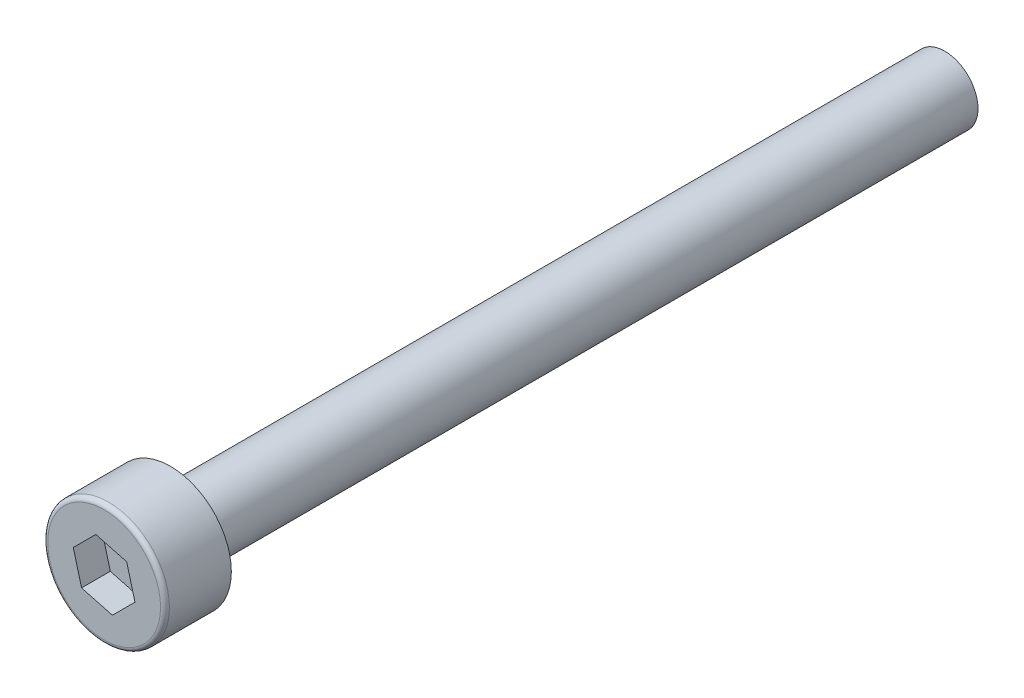
ISO-10303-21;
HEADER;
FILE_DESCRIPTION(('STEP AP214'),'2;1');
FILE_NAME('part.step','',(''),(''),'','','');
FILE_SCHEMA(('AUTOMOTIVE_DESIGN { 1 0 10303 214 1 1 1 1 }'));
ENDSEC;
DATA;
#1=APPLICATION_CONTEXT('core data for automotive mechanical design processes');
#2=APPLICATION_PROTOCOL_DEFINITION('international standard','automotive_design',2000,#1);
#3=PRODUCT_CONTEXT('',#1,'mechanical');
#4=PRODUCT('Part','Part','',(#3));
#5=PRODUCT_RELATED_PRODUCT_CATEGORY('part','',(#4));
#6=PRODUCT_DEFINITION_FORMATION('','',#4);
#7=PRODUCT_DEFINITION_CONTEXT('part definition',#1,'design');
#8=PRODUCT_DEFINITION('design','',#6,#7);
#9=PRODUCT_DEFINITION_SHAPE('','',#8);
#10=(LENGTH_UNIT() NAMED_UNIT(*) SI_UNIT(.MILLI.,.METRE.));
#11=(NAMED_UNIT(*) PLANE_ANGLE_UNIT() SI_UNIT($,.RADIAN.));
#12=(NAMED_UNIT(*) SI_UNIT($,.STERADIAN.) SOLID_ANGLE_UNIT());
#13=UNCERTAINTY_MEASURE_WITH_UNIT(LENGTH_MEASURE(1.E-05),#10,'distance_accuracy_value','');
#14=(GEOMETRIC_REPRESENTATION_CONTEXT(3) GLOBAL_UNCERTAINTY_ASSIGNED_CONTEXT((#13)) GLOBAL_UNIT_ASSIGNED_CONTEXT((#10,
#11,#12)) REPRESENTATION_CONTEXT('',''));
#15=CARTESIAN_POINT('',(0.,0.,0.));
#16=DIRECTION('',(0.,0.,1.));
#17=DIRECTION('',(1.,0.,0.));
#18=AXIS2_PLACEMENT_3D('',#15,#16,#17);
#19=CARTESIAN_POINT('',(0.,0.,0.));
#20=DIRECTION('',(0.,0.,1.));
#21=DIRECTION('',(1.,0.,0.));
#22=AXIS2_PLACEMENT_3D('',#19,#20,#21);
#23=PLANE('',#22);
#24=CARTESIAN_POINT('',(0.,0.,0.));
#25=DIRECTION('',(0.,0.,1.));
#26=DIRECTION('',(1.,0.,0.));
#27=AXIS2_PLACEMENT_3D('',#24,#25,#26);
#28=CIRCLE('',#27,2.75);
#29=CARTESIAN_POINT('',(2.75,0.,0.));
#30=VERTEX_POINT('',#29);
#31=EDGE_CURVE('E137',#30,#30,#28,.T.);
#32=ORIENTED_EDGE('',*,*,#31,.F.);
#33=EDGE_LOOP('',(#32));
#34=FACE_BOUND('',#33,.T.);
#35=CARTESIAN_POINT('',(0.,0.,0.));
#36=DIRECTION('',(0.,0.,1.));
#37=DIRECTION('',(1.,0.,0.));
#38=AXIS2_PLACEMENT_3D('',#35,#36,#37);
#39=CIRCLE('',#38,1.5);
#40=CARTESIAN_POINT('',(1.5,0.,0.));
#41=VERTEX_POINT('',#40);
#42=EDGE_CURVE('E145',#41,#41,#39,.F.);
#43=ORIENTED_EDGE('',*,*,#42,.F.);
#44=EDGE_LOOP('',(#43));
#45=FACE_BOUND('',#44,.T.);
#46=ADVANCED_FACE('F34',(#34,#45),#23,.F.);
#47=CARTESIAN_POINT('',(0.,0.,3.));
#48=DIRECTION('',(0.,0.,-1.));
#49=DIRECTION('',(-1.,0.,0.));
#50=AXIS2_PLACEMENT_3D('',#47,#48,#49);
#51=CYLINDRICAL_SURFACE('',#50,2.75);
#52=CARTESIAN_POINT('',(0.,0.,2.8));
#53=DIRECTION('',(0.,0.,1.));
#54=DIRECTION('',(1.,0.,0.));
#55=AXIS2_PLACEMENT_3D('',#52,#53,#54);
#56=CIRCLE('',#55,2.75);
#57=CARTESIAN_POINT('',(2.75,0.,2.8));
#58=VERTEX_POINT('',#57);
#59=EDGE_CURVE('E11',#58,#58,#56,.F.);
#60=ORIENTED_EDGE('',*,*,#59,.T.);
#61=EDGE_LOOP('',(#60));
#62=FACE_BOUND('',#61,.T.);
#63=ORIENTED_EDGE('',*,*,#31,.T.);
#64=EDGE_LOOP('',(#63));
#65=FACE_BOUND('',#64,.T.);
#66=ADVANCED_FACE('F164',(#62,#65),#51,.T.);
#67=CARTESIAN_POINT('',(0.,0.,3.));
#68=DIRECTION('',(0.,0.,1.));
#69=DIRECTION('',(1.,0.,0.));
#70=AXIS2_PLACEMENT_3D('',#67,#68,#69);
#71=PLANE('',#70);
#72=CARTESIAN_POINT('',(0.,0.,3.));
#73=DIRECTION('',(0.,0.,1.));
#74=DIRECTION('',(1.,0.,0.));
#75=AXIS2_PLACEMENT_3D('',#72,#73,#74);
#76=CIRCLE('',#75,2.55);
#77=CARTESIAN_POINT('',(2.55,0.,3.));
#78=VERTEX_POINT('',#77);
#79=EDGE_CURVE('E42',#78,#78,#76,.T.);
#80=ORIENTED_EDGE('',*,*,#79,.T.);
#81=EDGE_LOOP('',(#80));
#82=FACE_BOUND('',#81,.T.);
#83=DIRECTION('',(0.258819045102521,-0.965925826289068,0.));
#84=VECTOR('',#83,1.);
#85=CARTESIAN_POINT('',(-1.39419383956301,0.373573113403356,3.));
#86=LINE('',#85,#84);
#87=CARTESIAN_POINT('',(-1.39419383956301,0.373573113403356,3.));
#88=VERTEX_POINT('',#87);
#89=CARTESIAN_POINT('',(-1.02062072615966,-1.02062072615966,3.));
#90=VERTEX_POINT('',#89);
#91=EDGE_CURVE('E49',#88,#90,#86,.T.);
#92=ORIENTED_EDGE('',*,*,#91,.F.);
#93=DIRECTION('',(-0.707106781186548,-0.707106781186548,0.));
#94=VECTOR('',#93,1.);
#95=CARTESIAN_POINT('',(-0.373573113403355,1.39419383956301,3.));
#96=LINE('',#95,#94);
#97=CARTESIAN_POINT('',(-0.373573113403355,1.39419383956301,3.));
#98=VERTEX_POINT('',#97);
#99=EDGE_CURVE('E133',#98,#88,#96,.T.);
#100=ORIENTED_EDGE('',*,*,#99,.F.);
#101=DIRECTION('',(-0.965925826289068,0.258819045102521,0.));
#102=VECTOR('',#101,1.);
#103=CARTESIAN_POINT('',(1.02062072615966,1.02062072615966,3.));
#104=LINE('',#103,#102);
#105=CARTESIAN_POINT('',(1.02062072615966,1.02062072615966,3.));
#106=VERTEX_POINT('',#105);
#107=EDGE_CURVE('E131',#106,#98,#104,.T.);
#108=ORIENTED_EDGE('',*,*,#107,.F.);
#109=DIRECTION('',(-0.258819045102521,0.965925826289068,0.));
#110=VECTOR('',#109,1.);
#111=CARTESIAN_POINT('',(1.39419383956301,-0.373573113403355,3.));
#112=LINE('',#111,#110);
#113=CARTESIAN_POINT('',(1.39419383956301,-0.373573113403355,3.));
#114=VERTEX_POINT('',#113);
#115=EDGE_CURVE('E97',#114,#106,#112,.T.);
#116=ORIENTED_EDGE('',*,*,#115,.F.);
#117=DIRECTION('',(0.707106781186548,0.707106781186548,0.));
#118=VECTOR('',#117,1.);
#119=CARTESIAN_POINT('',(0.373573113403355,-1.39419383956301,3.));
#120=LINE('',#119,#118);
#121=CARTESIAN_POINT('',(0.373573113403355,-1.39419383956301,3.));
#122=VERTEX_POINT('',#121);
#123=EDGE_CURVE('E127',#122,#114,#120,.T.);
#124=ORIENTED_EDGE('',*,*,#123,.F.);
#125=DIRECTION('',(0.965925826289068,-0.258819045102521,0.));
#126=VECTOR('',#125,1.);
#127=CARTESIAN_POINT('',(-1.02062072615966,-1.02062072615966,3.));
#128=LINE('',#127,#126);
#129=EDGE_CURVE('E123',#90,#122,#128,.T.);
#130=ORIENTED_EDGE('',*,*,#129,.F.);
#131=EDGE_LOOP('',(#92,#100,#108,#116,#124,#130));
#132=FACE_BOUND('',#131,.T.);
#133=ADVANCED_FACE('F150',(#82,#132),#71,.T.);
#134=CARTESIAN_POINT('',(-1.39419383956301,0.373573113403356,1.7));
#135=DIRECTION('',(-0.965925826289068,-0.258819045102521,0.));
#136=DIRECTION('',(0.258819045102521,-0.965925826289068,0.));
#137=AXIS2_PLACEMENT_3D('',#134,#135,#136);
#138=PLANE('',#137);
#139=ORIENTED_EDGE('',*,*,#91,.T.);
#140=DIRECTION('',(0.,0.,1.));
#141=VECTOR('',#140,1.);
#142=CARTESIAN_POINT('',(-1.02062072615966,-1.02062072615966,1.7));
#143=LINE('',#142,#141);
#144=CARTESIAN_POINT('',(-1.02062072615966,-1.02062072615966,1.7));
#145=VERTEX_POINT('',#144);
#146=EDGE_CURVE('E79',#145,#90,#143,.T.);
#147=ORIENTED_EDGE('',*,*,#146,.F.);
#148=DIRECTION('',(0.258819045102521,-0.965925826289068,0.));
#149=VECTOR('',#148,1.);
#150=CARTESIAN_POINT('',(-1.39419383956301,0.373573113403356,1.7));
#151=LINE('',#150,#149);
#152=CARTESIAN_POINT('',(-1.39419383956301,0.373573113403356,1.7));
#153=VERTEX_POINT('',#152);
#154=EDGE_CURVE('E135',#153,#145,#151,.T.);
#155=ORIENTED_EDGE('',*,*,#154,.F.);
#156=DIRECTION('',(0.,0.,1.));
#157=VECTOR('',#156,1.);
#158=CARTESIAN_POINT('',(-1.39419383956301,0.373573113403356,1.7));
#159=LINE('',#158,#157);
#160=EDGE_CURVE('E57',#153,#88,#159,.T.);
#161=ORIENTED_EDGE('',*,*,#160,.T.);
#162=EDGE_LOOP('',(#139,#147,#155,#161));
#163=FACE_BOUND('',#162,.T.);
#164=ADVANCED_FACE('F176',(#163),#138,.F.);
#165=CARTESIAN_POINT('',(-0.373573113403355,1.39419383956301,1.7));
#166=DIRECTION('',(-0.707106781186548,0.707106781186548,0.));
#167=DIRECTION('',(-0.707106781186548,-0.707106781186548,0.));
#168=AXIS2_PLACEMENT_3D('',#165,#166,#167);
#169=PLANE('',#168);
#170=ORIENTED_EDGE('',*,*,#99,.T.);
#171=ORIENTED_EDGE('',*,*,#160,.F.);
#172=DIRECTION('',(-0.707106781186548,-0.707106781186548,0.));
#173=VECTOR('',#172,1.);
#174=CARTESIAN_POINT('',(-0.373573113403355,1.39419383956301,1.7));
#175=LINE('',#174,#173);
#176=CARTESIAN_POINT('',(-0.373573113403355,1.39419383956301,1.7));
#177=VERTEX_POINT('',#176);
#178=EDGE_CURVE('E109',#177,#153,#175,.T.);
#179=ORIENTED_EDGE('',*,*,#178,.F.);
#180=DIRECTION('',(0.,0.,1.));
#181=VECTOR('',#180,1.);
#182=CARTESIAN_POINT('',(-0.373573113403355,1.39419383956301,1.7));
#183=LINE('',#182,#181);
#184=EDGE_CURVE('E101',#177,#98,#183,.T.);
#185=ORIENTED_EDGE('',*,*,#184,.T.);
#186=EDGE_LOOP('',(#170,#171,#179,#185));
#187=FACE_BOUND('',#186,.T.);
#188=ADVANCED_FACE('F179',(#187),#169,.F.);
#189=CARTESIAN_POINT('',(1.02062072615966,1.02062072615966,1.7));
#190=DIRECTION('',(0.258819045102521,0.965925826289068,0.));
#191=DIRECTION('',(-0.965925826289068,0.258819045102521,0.));
#192=AXIS2_PLACEMENT_3D('',#189,#190,#191);
#193=PLANE('',#192);
#194=ORIENTED_EDGE('',*,*,#107,.T.);
#195=ORIENTED_EDGE('',*,*,#184,.F.);
#196=DIRECTION('',(-0.965925826289068,0.258819045102521,0.));
#197=VECTOR('',#196,1.);
#198=CARTESIAN_POINT('',(1.02062072615966,1.02062072615966,1.7));
#199=LINE('',#198,#197);
#200=CARTESIAN_POINT('',(1.02062072615966,1.02062072615966,1.7));
#201=VERTEX_POINT('',#200);
#202=EDGE_CURVE('E105',#201,#177,#199,.T.);
#203=ORIENTED_EDGE('',*,*,#202,.F.);
#204=DIRECTION('',(0.,0.,1.));
#205=VECTOR('',#204,1.);
#206=CARTESIAN_POINT('',(1.02062072615966,1.02062072615966,1.7));
#207=LINE('',#206,#205);
#208=EDGE_CURVE('E90',#201,#106,#207,.T.);
#209=ORIENTED_EDGE('',*,*,#208,.T.);
#210=EDGE_LOOP('',(#194,#195,#203,#209));
#211=FACE_BOUND('',#210,.T.);
#212=ADVANCED_FACE('F106',(#211),#193,.F.);
#213=CARTESIAN_POINT('',(1.39419383956301,-0.373573113403355,1.7));
#214=DIRECTION('',(0.965925826289068,0.258819045102521,0.));
#215=DIRECTION('',(-0.258819045102521,0.965925826289068,0.));
#216=AXIS2_PLACEMENT_3D('',#213,#214,#215);
#217=PLANE('',#216);
#218=ORIENTED_EDGE('',*,*,#115,.T.);
#219=ORIENTED_EDGE('',*,*,#208,.F.);
#220=DIRECTION('',(-0.258819045102521,0.965925826289068,0.));
#221=VECTOR('',#220,1.);
#222=CARTESIAN_POINT('',(1.39419383956301,-0.373573113403355,1.7));
#223=LINE('',#222,#221);
#224=CARTESIAN_POINT('',(1.39419383956301,-0.373573113403355,1.7));
#225=VERTEX_POINT('',#224);
#226=EDGE_CURVE('E94',#225,#201,#223,.T.);
#227=ORIENTED_EDGE('',*,*,#226,.F.);
#228=DIRECTION('',(0.,0.,1.));
#229=VECTOR('',#228,1.);
#230=CARTESIAN_POINT('',(1.39419383956301,-0.373573113403355,1.7));
#231=LINE('',#230,#229);
#232=EDGE_CURVE('E102',#225,#114,#231,.T.);
#233=ORIENTED_EDGE('',*,*,#232,.T.);
#234=EDGE_LOOP('',(#218,#219,#227,#233));
#235=FACE_BOUND('',#234,.T.);
#236=ADVANCED_FACE('F92',(#235),#217,.F.);
#237=CARTESIAN_POINT('',(0.373573113403355,-1.39419383956301,1.7));
#238=DIRECTION('',(0.707106781186548,-0.707106781186548,0.));
#239=DIRECTION('',(0.707106781186548,0.707106781186548,0.));
#240=AXIS2_PLACEMENT_3D('',#237,#238,#239);
#241=PLANE('',#240);
#242=ORIENTED_EDGE('',*,*,#123,.T.);
#243=ORIENTED_EDGE('',*,*,#232,.F.);
#244=DIRECTION('',(0.707106781186548,0.707106781186548,0.));
#245=VECTOR('',#244,1.);
#246=CARTESIAN_POINT('',(0.373573113403355,-1.39419383956301,1.7));
#247=LINE('',#246,#245);
#248=CARTESIAN_POINT('',(0.373573113403355,-1.39419383956301,1.7));
#249=VERTEX_POINT('',#248);
#250=EDGE_CURVE('E115',#249,#225,#247,.T.);
#251=ORIENTED_EDGE('',*,*,#250,.F.);
#252=DIRECTION('',(0.,0.,1.));
#253=VECTOR('',#252,1.);
#254=CARTESIAN_POINT('',(0.373573113403355,-1.39419383956301,1.7));
#255=LINE('',#254,#253);
#256=EDGE_CURVE('E140',#249,#122,#255,.T.);
#257=ORIENTED_EDGE('',*,*,#256,.T.);
#258=EDGE_LOOP('',(#242,#243,#251,#257));
#259=FACE_BOUND('',#258,.T.);
#260=ADVANCED_FACE('F183',(#259),#241,.F.);
#261=CARTESIAN_POINT('',(-1.02062072615966,-1.02062072615966,1.7));
#262=DIRECTION('',(-0.258819045102521,-0.965925826289068,0.));
#263=DIRECTION('',(0.965925826289068,-0.258819045102521,0.));
#264=AXIS2_PLACEMENT_3D('',#261,#262,#263);
#265=PLANE('',#264);
#266=ORIENTED_EDGE('',*,*,#129,.T.);
#267=ORIENTED_EDGE('',*,*,#256,.F.);
#268=DIRECTION('',(0.965925826289068,-0.258819045102521,0.));
#269=VECTOR('',#268,1.);
#270=CARTESIAN_POINT('',(-1.02062072615966,-1.02062072615966,1.7));
#271=LINE('',#270,#269);
#272=EDGE_CURVE('E117',#145,#249,#271,.T.);
#273=ORIENTED_EDGE('',*,*,#272,.F.);
#274=ORIENTED_EDGE('',*,*,#146,.T.);
#275=EDGE_LOOP('',(#266,#267,#273,#274));
#276=FACE_BOUND('',#275,.T.);
#277=ADVANCED_FACE('F180',(#276),#265,.F.);
#278=CARTESIAN_POINT('',(0.,0.,1.7));
#279=DIRECTION('',(0.,0.,1.));
#280=DIRECTION('',(1.,0.,0.));
#281=AXIS2_PLACEMENT_3D('',#278,#279,#280);
#282=PLANE('',#281);
#283=ORIENTED_EDGE('',*,*,#154,.T.);
#284=ORIENTED_EDGE('',*,*,#272,.T.);
#285=ORIENTED_EDGE('',*,*,#250,.T.);
#286=ORIENTED_EDGE('',*,*,#226,.T.);
#287=ORIENTED_EDGE('',*,*,#202,.T.);
#288=ORIENTED_EDGE('',*,*,#178,.T.);
#289=EDGE_LOOP('',(#283,#284,#285,#286,#287,#288));
#290=FACE_BOUND('',#289,.T.);
#291=ADVANCED_FACE('F112',(#290),#282,.T.);
#292=CARTESIAN_POINT('',(0.,0.,-35.));
#293=DIRECTION('',(0.,0.,1.));
#294=DIRECTION('',(1.,0.,0.));
#295=AXIS2_PLACEMENT_3D('',#292,#293,#294);
#296=CYLINDRICAL_SURFACE('',#295,1.5);
#297=CARTESIAN_POINT('',(0.,0.,-35.));
#298=DIRECTION('',(0.,0.,-1.));
#299=DIRECTION('',(-1.,0.,0.));
#300=AXIS2_PLACEMENT_3D('',#297,#298,#299);
#301=CIRCLE('',#300,1.5);
#302=CARTESIAN_POINT('',(-1.5,0.,-35.));
#303=VERTEX_POINT('',#302);
#304=EDGE_CURVE('E124',#303,#303,#301,.T.);
#305=ORIENTED_EDGE('',*,*,#304,.F.);
#306=EDGE_LOOP('',(#305));
#307=FACE_BOUND('',#306,.T.);
#308=ORIENTED_EDGE('',*,*,#42,.T.);
#309=EDGE_LOOP('',(#308));
#310=FACE_BOUND('',#309,.T.);
#311=ADVANCED_FACE('F159',(#307,#310),#296,.T.);
#312=CARTESIAN_POINT('',(0.,0.,-35.));
#313=DIRECTION('',(0.,0.,-1.));
#314=DIRECTION('',(-1.,0.,0.));
#315=AXIS2_PLACEMENT_3D('',#312,#313,#314);
#316=PLANE('',#315);
#317=ORIENTED_EDGE('',*,*,#304,.T.);
#318=EDGE_LOOP('',(#317));
#319=FACE_BOUND('',#318,.T.);
#320=ADVANCED_FACE('F154',(#319),#316,.T.);
#321=CARTESIAN_POINT('',(0.,0.,2.8));
#322=DIRECTION('',(0.,0.,1.));
#323=DIRECTION('',(1.,0.,0.));
#324=AXIS2_PLACEMENT_3D('',#321,#322,#323);
#325=TOROIDAL_SURFACE('',#324,2.55,0.2);
#326=ORIENTED_EDGE('',*,*,#59,.F.);
#327=EDGE_LOOP('',(#326));
#328=FACE_BOUND('',#327,.T.);
#329=ORIENTED_EDGE('',*,*,#79,.F.);
#330=EDGE_LOOP('',(#329));
#331=FACE_BOUND('',#330,.T.);
#332=ADVANCED_FACE('F36',(#328,#331),#325,.T.);
#333=CLOSED_SHELL('',(#46,#66,#133,#164,#188,#212,#236,#260,#277,#291,#311,#320,#332));
#334=MANIFOLD_SOLID_BREP('B2',#333);
#335=ADVANCED_BREP_SHAPE_REPRESENTATION('',(#18,#334),#14);
#336=SHAPE_DEFINITION_REPRESENTATION(#9,#335);
ENDSEC;
END-ISO-10303-21;
